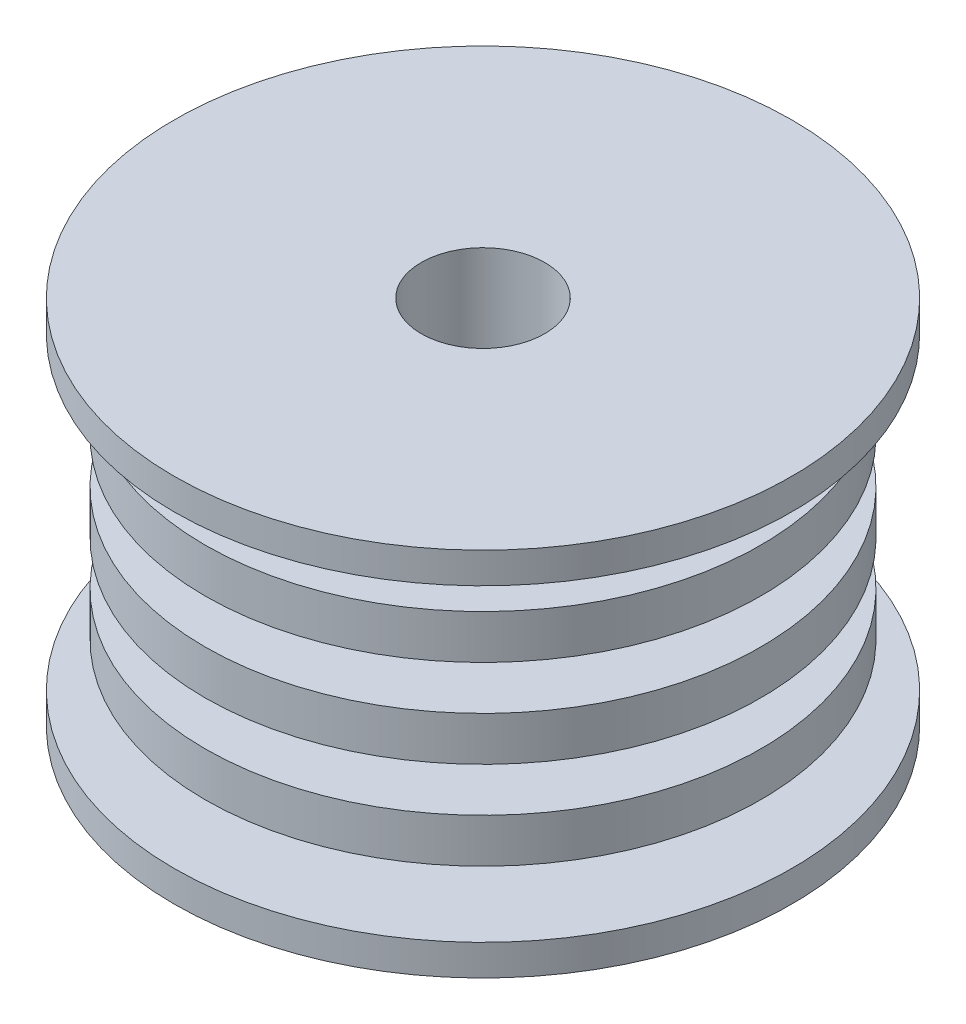
ISO-10303-21;
HEADER;
FILE_DESCRIPTION(('STEP AP214'),'2;1');
FILE_NAME('part.step','',(''),(''),'','','');
FILE_SCHEMA(('AUTOMOTIVE_DESIGN { 1 0 10303 214 1 1 1 1 }'));
ENDSEC;
DATA;
#1=APPLICATION_CONTEXT('core data for automotive mechanical design processes');
#2=APPLICATION_PROTOCOL_DEFINITION('international standard','automotive_design',2000,#1);
#3=PRODUCT_CONTEXT('',#1,'mechanical');
#4=PRODUCT('Part','Part','',(#3));
#5=PRODUCT_RELATED_PRODUCT_CATEGORY('part','',(#4));
#6=PRODUCT_DEFINITION_FORMATION('','',#4);
#7=PRODUCT_DEFINITION_CONTEXT('part definition',#1,'design');
#8=PRODUCT_DEFINITION('design','',#6,#7);
#9=PRODUCT_DEFINITION_SHAPE('','',#8);
#10=(LENGTH_UNIT() NAMED_UNIT(*) SI_UNIT(.MILLI.,.METRE.));
#11=(NAMED_UNIT(*) PLANE_ANGLE_UNIT() SI_UNIT($,.RADIAN.));
#12=(NAMED_UNIT(*) SI_UNIT($,.STERADIAN.) SOLID_ANGLE_UNIT());
#13=UNCERTAINTY_MEASURE_WITH_UNIT(LENGTH_MEASURE(1.E-05),#10,'distance_accuracy_value','');
#14=(GEOMETRIC_REPRESENTATION_CONTEXT(3) GLOBAL_UNCERTAINTY_ASSIGNED_CONTEXT((#13)) GLOBAL_UNIT_ASSIGNED_CONTEXT((#10,
#11,#12)) REPRESENTATION_CONTEXT('',''));
#15=CARTESIAN_POINT('',(0.,0.,0.));
#16=DIRECTION('',(0.,0.,1.));
#17=DIRECTION('',(1.,0.,0.));
#18=AXIS2_PLACEMENT_3D('',#15,#16,#17);
#19=CARTESIAN_POINT('',(0.,-52.0779304422814,0.));
#20=DIRECTION('',(0.,-1.,0.));
#21=DIRECTION('',(0.,0.,-1.));
#22=AXIS2_PLACEMENT_3D('',#19,#20,#21);
#23=CYLINDRICAL_SURFACE('',#22,12.);
#24=CARTESIAN_POINT('',(0.,10.,0.));
#25=DIRECTION('',(0.,-1.,0.));
#26=DIRECTION('',(0.,0.,-1.));
#27=AXIS2_PLACEMENT_3D('',#24,#25,#26);
#28=CIRCLE('',#27,12.);
#29=CARTESIAN_POINT('',(0.,10.,-12.));
#30=VERTEX_POINT('',#29);
#31=EDGE_CURVE('E12',#30,#30,#28,.T.);
#32=ORIENTED_EDGE('',*,*,#31,.T.);
#33=EDGE_LOOP('',(#32));
#34=FACE_BOUND('',#33,.T.);
#35=CARTESIAN_POINT('',(0.,7.14285714285715,0.));
#36=DIRECTION('',(0.,-1.,0.));
#37=DIRECTION('',(0.,0.,-1.));
#38=AXIS2_PLACEMENT_3D('',#35,#36,#37);
#39=CIRCLE('',#38,12.);
#40=CARTESIAN_POINT('',(0.,7.14285714285715,-12.));
#41=VERTEX_POINT('',#40);
#42=EDGE_CURVE('E124',#41,#41,#39,.T.);
#43=ORIENTED_EDGE('',*,*,#42,.F.);
#44=EDGE_LOOP('',(#43));
#45=FACE_BOUND('',#44,.T.);
#46=ADVANCED_FACE('F49',(#34,#45),#23,.T.);
#47=CARTESIAN_POINT('',(0.,10.,-20.));
#48=DIRECTION('',(0.,-1.,0.));
#49=DIRECTION('',(0.,0.,-1.));
#50=AXIS2_PLACEMENT_3D('',#47,#48,#49);
#51=PLANE('',#50);
#52=CARTESIAN_POINT('',(0.,10.,0.));
#53=DIRECTION('',(0.,-1.,0.));
#54=DIRECTION('',(0.,0.,-1.));
#55=AXIS2_PLACEMENT_3D('',#52,#53,#54);
#56=CIRCLE('',#55,20.);
#57=CARTESIAN_POINT('',(0.,10.,-20.));
#58=VERTEX_POINT('',#57);
#59=EDGE_CURVE('E56',#58,#58,#56,.T.);
#60=ORIENTED_EDGE('',*,*,#59,.T.);
#61=EDGE_LOOP('',(#60));
#62=FACE_BOUND('',#61,.T.);
#63=ORIENTED_EDGE('',*,*,#31,.F.);
#64=EDGE_LOOP('',(#63));
#65=FACE_BOUND('',#64,.T.);
#66=ADVANCED_FACE('F156',(#62,#65),#51,.T.);
#67=CARTESIAN_POINT('',(0.,-52.0779304422814,0.));
#68=DIRECTION('',(0.,-1.,0.));
#69=DIRECTION('',(0.,0.,-1.));
#70=AXIS2_PLACEMENT_3D('',#67,#68,#69);
#71=CYLINDRICAL_SURFACE('',#70,20.);
#72=CARTESIAN_POINT('',(0.,12.,0.));
#73=DIRECTION('',(0.,-1.,0.));
#74=DIRECTION('',(0.,0.,-1.));
#75=AXIS2_PLACEMENT_3D('',#72,#73,#74);
#76=CIRCLE('',#75,20.);
#77=CARTESIAN_POINT('',(0.,12.,-20.));
#78=VERTEX_POINT('',#77);
#79=EDGE_CURVE('E61',#78,#78,#76,.T.);
#80=ORIENTED_EDGE('',*,*,#79,.T.);
#81=EDGE_LOOP('',(#80));
#82=FACE_BOUND('',#81,.T.);
#83=ORIENTED_EDGE('',*,*,#59,.F.);
#84=EDGE_LOOP('',(#83));
#85=FACE_BOUND('',#84,.T.);
#86=ADVANCED_FACE('F150',(#82,#85),#71,.T.);
#87=CARTESIAN_POINT('',(0.,12.,0.));
#88=DIRECTION('',(0.,1.,0.));
#89=DIRECTION('',(0.,0.,1.));
#90=AXIS2_PLACEMENT_3D('',#87,#88,#89);
#91=PLANE('',#90);
#92=CARTESIAN_POINT('',(0.,12.,0.));
#93=DIRECTION('',(0.,1.,0.));
#94=DIRECTION('',(0.,0.,1.));
#95=AXIS2_PLACEMENT_3D('',#92,#93,#94);
#96=CIRCLE('',#95,4.);
#97=CARTESIAN_POINT('',(0.,12.,4.));
#98=VERTEX_POINT('',#97);
#99=EDGE_CURVE('E129',#98,#98,#96,.T.);
#100=ORIENTED_EDGE('',*,*,#99,.F.);
#101=EDGE_LOOP('',(#100));
#102=FACE_BOUND('',#101,.T.);
#103=ORIENTED_EDGE('',*,*,#79,.F.);
#104=EDGE_LOOP('',(#103));
#105=FACE_BOUND('',#104,.T.);
#106=ADVANCED_FACE('F147',(#102,#105),#91,.T.);
#107=CARTESIAN_POINT('',(0.,-12.,-20.));
#108=DIRECTION('',(0.,-1.,0.));
#109=DIRECTION('',(0.,0.,-1.));
#110=AXIS2_PLACEMENT_3D('',#107,#108,#109);
#111=PLANE('',#110);
#112=CARTESIAN_POINT('',(0.,-12.,0.));
#113=DIRECTION('',(0.,1.,0.));
#114=DIRECTION('',(0.,0.,1.));
#115=AXIS2_PLACEMENT_3D('',#112,#113,#114);
#116=CIRCLE('',#115,4.);
#117=CARTESIAN_POINT('',(0.,-12.,4.));
#118=VERTEX_POINT('',#117);
#119=EDGE_CURVE('E128',#118,#118,#116,.T.);
#120=ORIENTED_EDGE('',*,*,#119,.T.);
#121=EDGE_LOOP('',(#120));
#122=FACE_BOUND('',#121,.T.);
#123=CARTESIAN_POINT('',(0.,-12.,0.));
#124=DIRECTION('',(0.,-1.,0.));
#125=DIRECTION('',(0.,0.,-1.));
#126=AXIS2_PLACEMENT_3D('',#123,#124,#125);
#127=CIRCLE('',#126,20.);
#128=CARTESIAN_POINT('',(0.,-12.,-20.));
#129=VERTEX_POINT('',#128);
#130=EDGE_CURVE('E66',#129,#129,#127,.T.);
#131=ORIENTED_EDGE('',*,*,#130,.T.);
#132=EDGE_LOOP('',(#131));
#133=FACE_BOUND('',#132,.T.);
#134=ADVANCED_FACE('F137',(#122,#133),#111,.T.);
#135=CARTESIAN_POINT('',(0.,-52.0779304422814,0.));
#136=DIRECTION('',(0.,-1.,0.));
#137=DIRECTION('',(0.,0.,-1.));
#138=AXIS2_PLACEMENT_3D('',#135,#136,#137);
#139=CYLINDRICAL_SURFACE('',#138,20.);
#140=CARTESIAN_POINT('',(0.,-9.99999999999999,0.));
#141=DIRECTION('',(0.,-1.,0.));
#142=DIRECTION('',(0.,0.,-1.));
#143=AXIS2_PLACEMENT_3D('',#140,#141,#142);
#144=CIRCLE('',#143,20.);
#145=CARTESIAN_POINT('',(0.,-9.99999999999999,-20.));
#146=VERTEX_POINT('',#145);
#147=EDGE_CURVE('E72',#146,#146,#144,.T.);
#148=ORIENTED_EDGE('',*,*,#147,.T.);
#149=EDGE_LOOP('',(#148));
#150=FACE_BOUND('',#149,.T.);
#151=ORIENTED_EDGE('',*,*,#130,.F.);
#152=EDGE_LOOP('',(#151));
#153=FACE_BOUND('',#152,.T.);
#154=ADVANCED_FACE('F241',(#150,#153),#139,.T.);
#155=CARTESIAN_POINT('',(0.,-9.99999999999999,-12.));
#156=DIRECTION('',(0.,1.,0.));
#157=DIRECTION('',(0.,0.,1.));
#158=AXIS2_PLACEMENT_3D('',#155,#156,#157);
#159=PLANE('',#158);
#160=CARTESIAN_POINT('',(0.,-9.99999999999999,0.));
#161=DIRECTION('',(0.,-1.,0.));
#162=DIRECTION('',(0.,0.,-1.));
#163=AXIS2_PLACEMENT_3D('',#160,#161,#162);
#164=CIRCLE('',#163,12.);
#165=CARTESIAN_POINT('',(0.,-9.99999999999999,-12.));
#166=VERTEX_POINT('',#165);
#167=EDGE_CURVE('E76',#166,#166,#164,.T.);
#168=ORIENTED_EDGE('',*,*,#167,.T.);
#169=EDGE_LOOP('',(#168));
#170=FACE_BOUND('',#169,.T.);
#171=ORIENTED_EDGE('',*,*,#147,.F.);
#172=EDGE_LOOP('',(#171));
#173=FACE_BOUND('',#172,.T.);
#174=ADVANCED_FACE('F235',(#170,#173),#159,.T.);
#175=CARTESIAN_POINT('',(0.,-52.0779304422814,0.));
#176=DIRECTION('',(0.,-1.,0.));
#177=DIRECTION('',(0.,0.,-1.));
#178=AXIS2_PLACEMENT_3D('',#175,#176,#177);
#179=CYLINDRICAL_SURFACE('',#178,12.);
#180=CARTESIAN_POINT('',(0.,-7.14285714285714,0.));
#181=DIRECTION('',(0.,-1.,0.));
#182=DIRECTION('',(0.,0.,-1.));
#183=AXIS2_PLACEMENT_3D('',#180,#181,#182);
#184=CIRCLE('',#183,12.);
#185=CARTESIAN_POINT('',(0.,-7.14285714285714,-12.));
#186=VERTEX_POINT('',#185);
#187=EDGE_CURVE('E80',#186,#186,#184,.T.);
#188=ORIENTED_EDGE('',*,*,#187,.T.);
#189=EDGE_LOOP('',(#188));
#190=FACE_BOUND('',#189,.T.);
#191=ORIENTED_EDGE('',*,*,#167,.F.);
#192=EDGE_LOOP('',(#191));
#193=FACE_BOUND('',#192,.T.);
#194=ADVANCED_FACE('F229',(#190,#193),#179,.T.);
#195=CARTESIAN_POINT('',(0.,-7.14285714285714,-18.));
#196=DIRECTION('',(0.,-1.,0.));
#197=DIRECTION('',(0.,0.,-1.));
#198=AXIS2_PLACEMENT_3D('',#195,#196,#197);
#199=PLANE('',#198);
#200=CARTESIAN_POINT('',(0.,-7.14285714285714,0.));
#201=DIRECTION('',(0.,-1.,0.));
#202=DIRECTION('',(0.,0.,-1.));
#203=AXIS2_PLACEMENT_3D('',#200,#201,#202);
#204=CIRCLE('',#203,18.);
#205=CARTESIAN_POINT('',(0.,-7.14285714285714,-18.));
#206=VERTEX_POINT('',#205);
#207=EDGE_CURVE('E84',#206,#206,#204,.T.);
#208=ORIENTED_EDGE('',*,*,#207,.T.);
#209=EDGE_LOOP('',(#208));
#210=FACE_BOUND('',#209,.T.);
#211=ORIENTED_EDGE('',*,*,#187,.F.);
#212=EDGE_LOOP('',(#211));
#213=FACE_BOUND('',#212,.T.);
#214=ADVANCED_FACE('F223',(#210,#213),#199,.T.);
#215=CARTESIAN_POINT('',(0.,-52.0779304422814,0.));
#216=DIRECTION('',(0.,-1.,0.));
#217=DIRECTION('',(0.,0.,-1.));
#218=AXIS2_PLACEMENT_3D('',#215,#216,#217);
#219=CYLINDRICAL_SURFACE('',#218,18.);
#220=CARTESIAN_POINT('',(0.,-4.28571428571428,0.));
#221=DIRECTION('',(0.,-1.,0.));
#222=DIRECTION('',(0.,0.,-1.));
#223=AXIS2_PLACEMENT_3D('',#220,#221,#222);
#224=CIRCLE('',#223,18.);
#225=CARTESIAN_POINT('',(0.,-4.28571428571428,-18.));
#226=VERTEX_POINT('',#225);
#227=EDGE_CURVE('E88',#226,#226,#224,.T.);
#228=ORIENTED_EDGE('',*,*,#227,.T.);
#229=EDGE_LOOP('',(#228));
#230=FACE_BOUND('',#229,.T.);
#231=ORIENTED_EDGE('',*,*,#207,.F.);
#232=EDGE_LOOP('',(#231));
#233=FACE_BOUND('',#232,.T.);
#234=ADVANCED_FACE('F217',(#230,#233),#219,.T.);
#235=CARTESIAN_POINT('',(0.,-4.28571428571428,-12.));
#236=DIRECTION('',(0.,1.,0.));
#237=DIRECTION('',(0.,0.,1.));
#238=AXIS2_PLACEMENT_3D('',#235,#236,#237);
#239=PLANE('',#238);
#240=CARTESIAN_POINT('',(0.,-4.28571428571428,0.));
#241=DIRECTION('',(0.,-1.,0.));
#242=DIRECTION('',(0.,0.,-1.));
#243=AXIS2_PLACEMENT_3D('',#240,#241,#242);
#244=CIRCLE('',#243,12.);
#245=CARTESIAN_POINT('',(0.,-4.28571428571428,-12.));
#246=VERTEX_POINT('',#245);
#247=EDGE_CURVE('E92',#246,#246,#244,.T.);
#248=ORIENTED_EDGE('',*,*,#247,.T.);
#249=EDGE_LOOP('',(#248));
#250=FACE_BOUND('',#249,.T.);
#251=ORIENTED_EDGE('',*,*,#227,.F.);
#252=EDGE_LOOP('',(#251));
#253=FACE_BOUND('',#252,.T.);
#254=ADVANCED_FACE('F211',(#250,#253),#239,.T.);
#255=CARTESIAN_POINT('',(0.,-52.0779304422814,0.));
#256=DIRECTION('',(0.,-1.,0.));
#257=DIRECTION('',(0.,0.,-1.));
#258=AXIS2_PLACEMENT_3D('',#255,#256,#257);
#259=CYLINDRICAL_SURFACE('',#258,12.);
#260=CARTESIAN_POINT('',(0.,-1.42857142857142,0.));
#261=DIRECTION('',(0.,-1.,0.));
#262=DIRECTION('',(0.,0.,-1.));
#263=AXIS2_PLACEMENT_3D('',#260,#261,#262);
#264=CIRCLE('',#263,12.);
#265=CARTESIAN_POINT('',(0.,-1.42857142857142,-12.));
#266=VERTEX_POINT('',#265);
#267=EDGE_CURVE('E96',#266,#266,#264,.T.);
#268=ORIENTED_EDGE('',*,*,#267,.T.);
#269=EDGE_LOOP('',(#268));
#270=FACE_BOUND('',#269,.T.);
#271=ORIENTED_EDGE('',*,*,#247,.F.);
#272=EDGE_LOOP('',(#271));
#273=FACE_BOUND('',#272,.T.);
#274=ADVANCED_FACE('F205',(#270,#273),#259,.T.);
#275=CARTESIAN_POINT('',(0.,-1.42857142857142,-18.));
#276=DIRECTION('',(0.,-1.,0.));
#277=DIRECTION('',(0.,0.,-1.));
#278=AXIS2_PLACEMENT_3D('',#275,#276,#277);
#279=PLANE('',#278);
#280=CARTESIAN_POINT('',(0.,-1.42857142857142,0.));
#281=DIRECTION('',(0.,-1.,0.));
#282=DIRECTION('',(0.,0.,-1.));
#283=AXIS2_PLACEMENT_3D('',#280,#281,#282);
#284=CIRCLE('',#283,18.);
#285=CARTESIAN_POINT('',(0.,-1.42857142857142,-18.));
#286=VERTEX_POINT('',#285);
#287=EDGE_CURVE('E100',#286,#286,#284,.T.);
#288=ORIENTED_EDGE('',*,*,#287,.T.);
#289=EDGE_LOOP('',(#288));
#290=FACE_BOUND('',#289,.T.);
#291=ORIENTED_EDGE('',*,*,#267,.F.);
#292=EDGE_LOOP('',(#291));
#293=FACE_BOUND('',#292,.T.);
#294=ADVANCED_FACE('F199',(#290,#293),#279,.T.);
#295=CARTESIAN_POINT('',(0.,-52.0779304422814,0.));
#296=DIRECTION('',(0.,-1.,0.));
#297=DIRECTION('',(0.,0.,-1.));
#298=AXIS2_PLACEMENT_3D('',#295,#296,#297);
#299=CYLINDRICAL_SURFACE('',#298,18.);
#300=CARTESIAN_POINT('',(0.,1.42857142857143,0.));
#301=DIRECTION('',(0.,-1.,0.));
#302=DIRECTION('',(0.,0.,-1.));
#303=AXIS2_PLACEMENT_3D('',#300,#301,#302);
#304=CIRCLE('',#303,18.);
#305=CARTESIAN_POINT('',(0.,1.42857142857143,-18.));
#306=VERTEX_POINT('',#305);
#307=EDGE_CURVE('E104',#306,#306,#304,.T.);
#308=ORIENTED_EDGE('',*,*,#307,.T.);
#309=EDGE_LOOP('',(#308));
#310=FACE_BOUND('',#309,.T.);
#311=ORIENTED_EDGE('',*,*,#287,.F.);
#312=EDGE_LOOP('',(#311));
#313=FACE_BOUND('',#312,.T.);
#314=ADVANCED_FACE('F193',(#310,#313),#299,.T.);
#315=CARTESIAN_POINT('',(0.,1.42857142857143,-12.));
#316=DIRECTION('',(0.,1.,0.));
#317=DIRECTION('',(0.,0.,1.));
#318=AXIS2_PLACEMENT_3D('',#315,#316,#317);
#319=PLANE('',#318);
#320=CARTESIAN_POINT('',(0.,1.42857142857143,0.));
#321=DIRECTION('',(0.,-1.,0.));
#322=DIRECTION('',(0.,0.,-1.));
#323=AXIS2_PLACEMENT_3D('',#320,#321,#322);
#324=CIRCLE('',#323,12.);
#325=CARTESIAN_POINT('',(0.,1.42857142857143,-12.));
#326=VERTEX_POINT('',#325);
#327=EDGE_CURVE('E108',#326,#326,#324,.T.);
#328=ORIENTED_EDGE('',*,*,#327,.T.);
#329=EDGE_LOOP('',(#328));
#330=FACE_BOUND('',#329,.T.);
#331=ORIENTED_EDGE('',*,*,#307,.F.);
#332=EDGE_LOOP('',(#331));
#333=FACE_BOUND('',#332,.T.);
#334=ADVANCED_FACE('F187',(#330,#333),#319,.T.);
#335=CARTESIAN_POINT('',(0.,-52.0779304422814,0.));
#336=DIRECTION('',(0.,-1.,0.));
#337=DIRECTION('',(0.,0.,-1.));
#338=AXIS2_PLACEMENT_3D('',#335,#336,#337);
#339=CYLINDRICAL_SURFACE('',#338,12.);
#340=CARTESIAN_POINT('',(0.,4.28571428571428,0.));
#341=DIRECTION('',(0.,-1.,0.));
#342=DIRECTION('',(0.,0.,-1.));
#343=AXIS2_PLACEMENT_3D('',#340,#341,#342);
#344=CIRCLE('',#343,12.);
#345=CARTESIAN_POINT('',(0.,4.28571428571428,-12.));
#346=VERTEX_POINT('',#345);
#347=EDGE_CURVE('E112',#346,#346,#344,.T.);
#348=ORIENTED_EDGE('',*,*,#347,.T.);
#349=EDGE_LOOP('',(#348));
#350=FACE_BOUND('',#349,.T.);
#351=ORIENTED_EDGE('',*,*,#327,.F.);
#352=EDGE_LOOP('',(#351));
#353=FACE_BOUND('',#352,.T.);
#354=ADVANCED_FACE('F181',(#350,#353),#339,.T.);
#355=CARTESIAN_POINT('',(0.,4.28571428571428,-18.));
#356=DIRECTION('',(0.,-1.,0.));
#357=DIRECTION('',(0.,0.,-1.));
#358=AXIS2_PLACEMENT_3D('',#355,#356,#357);
#359=PLANE('',#358);
#360=CARTESIAN_POINT('',(0.,4.28571428571429,0.));
#361=DIRECTION('',(0.,-1.,0.));
#362=DIRECTION('',(0.,0.,-1.));
#363=AXIS2_PLACEMENT_3D('',#360,#361,#362);
#364=CIRCLE('',#363,18.);
#365=CARTESIAN_POINT('',(0.,4.28571428571429,-18.));
#366=VERTEX_POINT('',#365);
#367=EDGE_CURVE('E116',#366,#366,#364,.T.);
#368=ORIENTED_EDGE('',*,*,#367,.T.);
#369=EDGE_LOOP('',(#368));
#370=FACE_BOUND('',#369,.T.);
#371=ORIENTED_EDGE('',*,*,#347,.F.);
#372=EDGE_LOOP('',(#371));
#373=FACE_BOUND('',#372,.T.);
#374=ADVANCED_FACE('F175',(#370,#373),#359,.T.);
#375=CARTESIAN_POINT('',(0.,-52.0779304422814,0.));
#376=DIRECTION('',(0.,-1.,0.));
#377=DIRECTION('',(0.,0.,-1.));
#378=AXIS2_PLACEMENT_3D('',#375,#376,#377);
#379=CYLINDRICAL_SURFACE('',#378,18.);
#380=CARTESIAN_POINT('',(0.,7.14285714285715,0.));
#381=DIRECTION('',(0.,-1.,0.));
#382=DIRECTION('',(0.,0.,-1.));
#383=AXIS2_PLACEMENT_3D('',#380,#381,#382);
#384=CIRCLE('',#383,18.);
#385=CARTESIAN_POINT('',(0.,7.14285714285715,-18.));
#386=VERTEX_POINT('',#385);
#387=EDGE_CURVE('E120',#386,#386,#384,.T.);
#388=ORIENTED_EDGE('',*,*,#387,.T.);
#389=EDGE_LOOP('',(#388));
#390=FACE_BOUND('',#389,.T.);
#391=ORIENTED_EDGE('',*,*,#367,.F.);
#392=EDGE_LOOP('',(#391));
#393=FACE_BOUND('',#392,.T.);
#394=ADVANCED_FACE('F169',(#390,#393),#379,.T.);
#395=CARTESIAN_POINT('',(0.,7.14285714285715,-12.));
#396=DIRECTION('',(0.,1.,0.));
#397=DIRECTION('',(0.,0.,1.));
#398=AXIS2_PLACEMENT_3D('',#395,#396,#397);
#399=PLANE('',#398);
#400=ORIENTED_EDGE('',*,*,#42,.T.);
#401=EDGE_LOOP('',(#400));
#402=FACE_BOUND('',#401,.T.);
#403=ORIENTED_EDGE('',*,*,#387,.F.);
#404=EDGE_LOOP('',(#403));
#405=FACE_BOUND('',#404,.T.);
#406=ADVANCED_FACE('F143',(#402,#405),#399,.T.);
#407=CARTESIAN_POINT('',(0.,-12.,0.));
#408=DIRECTION('',(0.,1.,0.));
#409=DIRECTION('',(0.,0.,1.));
#410=AXIS2_PLACEMENT_3D('',#407,#408,#409);
#411=CYLINDRICAL_SURFACE('',#410,4.);
#412=ORIENTED_EDGE('',*,*,#119,.F.);
#413=EDGE_LOOP('',(#412));
#414=FACE_BOUND('',#413,.T.);
#415=ORIENTED_EDGE('',*,*,#99,.T.);
#416=EDGE_LOOP('',(#415));
#417=FACE_BOUND('',#416,.T.);
#418=ADVANCED_FACE('F140',(#414,#417),#411,.F.);
#419=CLOSED_SHELL('',(#46,#66,#86,#106,#134,#154,#174,#194,#214,#234,#254,#274,#294,#314,#334,
#354,#374,#394,#406,#418));
#420=MANIFOLD_SOLID_BREP('B2',#419);
#421=ADVANCED_BREP_SHAPE_REPRESENTATION('',(#18,#420),#14);
#422=SHAPE_DEFINITION_REPRESENTATION(#9,#421);
ENDSEC;
END-ISO-10303-21;
